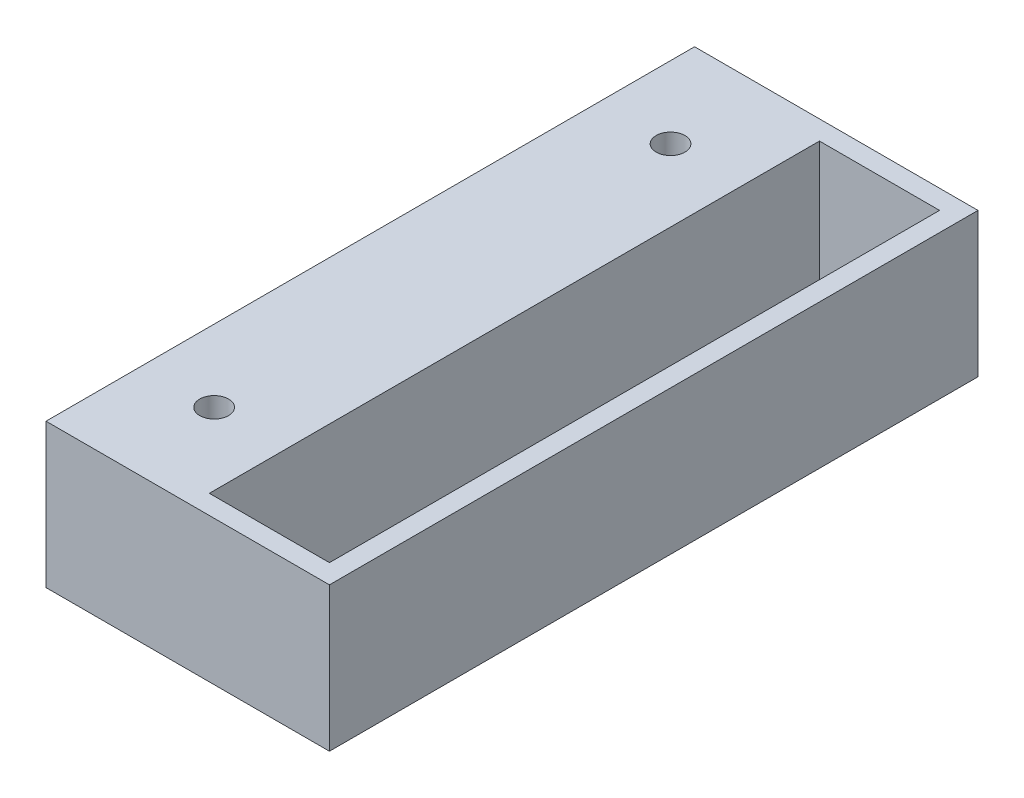
ISO-10303-21;
HEADER;
FILE_DESCRIPTION(('STEP AP214'),'2;1');
FILE_NAME('part.step','',(''),(''),'','','');
FILE_SCHEMA(('AUTOMOTIVE_DESIGN { 1 0 10303 214 1 1 1 1 }'));
ENDSEC;
DATA;
#1=APPLICATION_CONTEXT('core data for automotive mechanical design processes');
#2=APPLICATION_PROTOCOL_DEFINITION('international standard','automotive_design',2000,#1);
#3=PRODUCT_CONTEXT('',#1,'mechanical');
#4=PRODUCT('Part','Part','',(#3));
#5=PRODUCT_RELATED_PRODUCT_CATEGORY('part','',(#4));
#6=PRODUCT_DEFINITION_FORMATION('','',#4);
#7=PRODUCT_DEFINITION_CONTEXT('part definition',#1,'design');
#8=PRODUCT_DEFINITION('design','',#6,#7);
#9=PRODUCT_DEFINITION_SHAPE('','',#8);
#10=(LENGTH_UNIT() NAMED_UNIT(*) SI_UNIT(.MILLI.,.METRE.));
#11=(NAMED_UNIT(*) PLANE_ANGLE_UNIT() SI_UNIT($,.RADIAN.));
#12=(NAMED_UNIT(*) SI_UNIT($,.STERADIAN.) SOLID_ANGLE_UNIT());
#13=UNCERTAINTY_MEASURE_WITH_UNIT(LENGTH_MEASURE(1.E-05),#10,'distance_accuracy_value','');
#14=(GEOMETRIC_REPRESENTATION_CONTEXT(3) GLOBAL_UNCERTAINTY_ASSIGNED_CONTEXT((#13)) GLOBAL_UNIT_ASSIGNED_CONTEXT((#10,
#11,#12)) REPRESENTATION_CONTEXT('',''));
#15=CARTESIAN_POINT('',(0.,0.,0.));
#16=DIRECTION('',(0.,0.,1.));
#17=DIRECTION('',(1.,0.,0.));
#18=AXIS2_PLACEMENT_3D('',#15,#16,#17);
#19=CARTESIAN_POINT('',(0.,15.,0.));
#20=DIRECTION('',(0.,-1.,0.));
#21=DIRECTION('',(0.,0.,-1.));
#22=AXIS2_PLACEMENT_3D('',#19,#20,#21);
#23=PLANE('',#22);
#24=CARTESIAN_POINT('',(-13.75,15.,23.75));
#25=DIRECTION('',(0.,1.,0.));
#26=DIRECTION('',(0.,0.,1.));
#27=AXIS2_PLACEMENT_3D('',#24,#25,#26);
#28=CIRCLE('',#27,1.5);
#29=CARTESIAN_POINT('',(-13.75,15.,25.25));
#30=VERTEX_POINT('',#29);
#31=EDGE_CURVE('E127',#30,#30,#28,.T.);
#32=ORIENTED_EDGE('',*,*,#31,.F.);
#33=EDGE_LOOP('',(#32));
#34=FACE_BOUND('',#33,.T.);
#35=DIRECTION('',(-1.,0.,0.));
#36=VECTOR('',#35,1.);
#37=CARTESIAN_POINT('',(-8.24999999999999,15.,-33.75));
#38=LINE('',#37,#36);
#39=CARTESIAN_POINT('',(8.25,15.,-33.75));
#40=VERTEX_POINT('',#39);
#41=CARTESIAN_POINT('',(-21.25,15.,-33.75));
#42=VERTEX_POINT('',#41);
#43=EDGE_CURVE('E137',#40,#42,#38,.T.);
#44=ORIENTED_EDGE('',*,*,#43,.T.);
#45=DIRECTION('',(0.,0.,1.));
#46=VECTOR('',#45,1.);
#47=CARTESIAN_POINT('',(-21.25,15.,33.75));
#48=LINE('',#47,#46);
#49=CARTESIAN_POINT('',(-21.25,15.,33.75));
#50=VERTEX_POINT('',#49);
#51=EDGE_CURVE('E140',#42,#50,#48,.T.);
#52=ORIENTED_EDGE('',*,*,#51,.T.);
#53=DIRECTION('',(1.,0.,0.));
#54=VECTOR('',#53,1.);
#55=CARTESIAN_POINT('',(-8.24999999999999,15.,33.75));
#56=LINE('',#55,#54);
#57=CARTESIAN_POINT('',(8.25000000000001,15.,33.75));
#58=VERTEX_POINT('',#57);
#59=EDGE_CURVE('E143',#50,#58,#56,.T.);
#60=ORIENTED_EDGE('',*,*,#59,.T.);
#61=DIRECTION('',(0.,0.,-1.));
#62=VECTOR('',#61,1.);
#63=CARTESIAN_POINT('',(8.25000000000001,15.,33.75));
#64=LINE('',#63,#62);
#65=EDGE_CURVE('E145',#58,#40,#64,.T.);
#66=ORIENTED_EDGE('',*,*,#65,.T.);
#67=EDGE_LOOP('',(#44,#52,#60,#66));
#68=FACE_BOUND('',#67,.T.);
#69=DIRECTION('',(0.,0.,-1.));
#70=VECTOR('',#69,1.);
#71=CARTESIAN_POINT('',(6.25,15.,31.75));
#72=LINE('',#71,#70);
#73=CARTESIAN_POINT('',(6.25,15.,31.75));
#74=VERTEX_POINT('',#73);
#75=CARTESIAN_POINT('',(6.25,15.,-31.75));
#76=VERTEX_POINT('',#75);
#77=EDGE_CURVE('E98',#74,#76,#72,.T.);
#78=ORIENTED_EDGE('',*,*,#77,.F.);
#79=DIRECTION('',(1.,0.,0.));
#80=VECTOR('',#79,1.);
#81=CARTESIAN_POINT('',(-6.25,15.,31.75));
#82=LINE('',#81,#80);
#83=CARTESIAN_POINT('',(-6.25,15.,31.75));
#84=VERTEX_POINT('',#83);
#85=EDGE_CURVE('E121',#84,#74,#82,.T.);
#86=ORIENTED_EDGE('',*,*,#85,.F.);
#87=DIRECTION('',(0.,0.,1.));
#88=VECTOR('',#87,1.);
#89=CARTESIAN_POINT('',(-6.25,15.,31.75));
#90=LINE('',#89,#88);
#91=CARTESIAN_POINT('',(-6.25,15.,-31.75));
#92=VERTEX_POINT('',#91);
#93=EDGE_CURVE('E119',#92,#84,#90,.T.);
#94=ORIENTED_EDGE('',*,*,#93,.F.);
#95=DIRECTION('',(-1.,0.,0.));
#96=VECTOR('',#95,1.);
#97=CARTESIAN_POINT('',(-6.25,15.,-31.75));
#98=LINE('',#97,#96);
#99=EDGE_CURVE('E106',#76,#92,#98,.T.);
#100=ORIENTED_EDGE('',*,*,#99,.F.);
#101=EDGE_LOOP('',(#78,#86,#94,#100));
#102=FACE_BOUND('',#101,.T.);
#103=CARTESIAN_POINT('',(-13.75,15.,-23.75));
#104=DIRECTION('',(0.,1.,0.));
#105=DIRECTION('',(0.,0.,1.));
#106=AXIS2_PLACEMENT_3D('',#103,#104,#105);
#107=CIRCLE('',#106,1.5);
#108=CARTESIAN_POINT('',(-13.75,15.,-22.25));
#109=VERTEX_POINT('',#108);
#110=EDGE_CURVE('E294',#109,#109,#107,.T.);
#111=ORIENTED_EDGE('',*,*,#110,.F.);
#112=EDGE_LOOP('',(#111));
#113=FACE_BOUND('',#112,.T.);
#114=ADVANCED_FACE('F33',(#34,#68,#102,#113),#23,.F.);
#115=CARTESIAN_POINT('',(0.,0.,0.));
#116=DIRECTION('',(0.,-1.,0.));
#117=DIRECTION('',(0.,0.,-1.));
#118=AXIS2_PLACEMENT_3D('',#115,#116,#117);
#119=PLANE('',#118);
#120=CARTESIAN_POINT('',(-13.75,0.,23.75));
#121=DIRECTION('',(0.,1.,0.));
#122=DIRECTION('',(0.,0.,1.));
#123=AXIS2_PLACEMENT_3D('',#120,#121,#122);
#124=CIRCLE('',#123,1.5);
#125=CARTESIAN_POINT('',(-13.75,0.,25.25));
#126=VERTEX_POINT('',#125);
#127=EDGE_CURVE('E300',#126,#126,#124,.T.);
#128=ORIENTED_EDGE('',*,*,#127,.T.);
#129=EDGE_LOOP('',(#128));
#130=FACE_BOUND('',#129,.T.);
#131=DIRECTION('',(0.,0.,1.));
#132=VECTOR('',#131,1.);
#133=CARTESIAN_POINT('',(-21.25,0.,33.75));
#134=LINE('',#133,#132);
#135=CARTESIAN_POINT('',(-21.25,0.,-33.75));
#136=VERTEX_POINT('',#135);
#137=CARTESIAN_POINT('',(-21.25,0.,33.75));
#138=VERTEX_POINT('',#137);
#139=EDGE_CURVE('E114',#136,#138,#134,.T.);
#140=ORIENTED_EDGE('',*,*,#139,.F.);
#141=DIRECTION('',(-1.,0.,0.));
#142=VECTOR('',#141,1.);
#143=CARTESIAN_POINT('',(-8.24999999999999,0.,-33.75));
#144=LINE('',#143,#142);
#145=CARTESIAN_POINT('',(8.25,0.,-33.75));
#146=VERTEX_POINT('',#145);
#147=EDGE_CURVE('E141',#146,#136,#144,.T.);
#148=ORIENTED_EDGE('',*,*,#147,.F.);
#149=DIRECTION('',(0.,0.,-1.));
#150=VECTOR('',#149,1.);
#151=CARTESIAN_POINT('',(8.25000000000001,0.,33.75));
#152=LINE('',#151,#150);
#153=CARTESIAN_POINT('',(8.25000000000001,0.,33.75));
#154=VERTEX_POINT('',#153);
#155=EDGE_CURVE('E153',#154,#146,#152,.T.);
#156=ORIENTED_EDGE('',*,*,#155,.F.);
#157=DIRECTION('',(1.,0.,0.));
#158=VECTOR('',#157,1.);
#159=CARTESIAN_POINT('',(-8.24999999999999,0.,33.75));
#160=LINE('',#159,#158);
#161=EDGE_CURVE('E151',#138,#154,#160,.T.);
#162=ORIENTED_EDGE('',*,*,#161,.F.);
#163=EDGE_LOOP('',(#140,#148,#156,#162));
#164=FACE_BOUND('',#163,.T.);
#165=DIRECTION('',(1.,0.,0.));
#166=VECTOR('',#165,1.);
#167=CARTESIAN_POINT('',(-6.25,0.,31.75));
#168=LINE('',#167,#166);
#169=CARTESIAN_POINT('',(-6.25,0.,31.75));
#170=VERTEX_POINT('',#169);
#171=CARTESIAN_POINT('',(6.25,0.,31.75));
#172=VERTEX_POINT('',#171);
#173=EDGE_CURVE('E107',#170,#172,#168,.T.);
#174=ORIENTED_EDGE('',*,*,#173,.T.);
#175=DIRECTION('',(0.,0.,-1.));
#176=VECTOR('',#175,1.);
#177=CARTESIAN_POINT('',(6.25,0.,31.75));
#178=LINE('',#177,#176);
#179=CARTESIAN_POINT('',(6.25,0.,-31.75));
#180=VERTEX_POINT('',#179);
#181=EDGE_CURVE('E56',#172,#180,#178,.T.);
#182=ORIENTED_EDGE('',*,*,#181,.T.);
#183=DIRECTION('',(-1.,0.,0.));
#184=VECTOR('',#183,1.);
#185=CARTESIAN_POINT('',(-6.25,0.,-31.75));
#186=LINE('',#185,#184);
#187=CARTESIAN_POINT('',(-6.25,0.,-31.75));
#188=VERTEX_POINT('',#187);
#189=EDGE_CURVE('E113',#180,#188,#186,.T.);
#190=ORIENTED_EDGE('',*,*,#189,.T.);
#191=DIRECTION('',(0.,0.,1.));
#192=VECTOR('',#191,1.);
#193=CARTESIAN_POINT('',(-6.25,0.,31.75));
#194=LINE('',#193,#192);
#195=EDGE_CURVE('E129',#188,#170,#194,.T.);
#196=ORIENTED_EDGE('',*,*,#195,.T.);
#197=EDGE_LOOP('',(#174,#182,#190,#196));
#198=FACE_BOUND('',#197,.T.);
#199=CARTESIAN_POINT('',(-13.75,0.,-23.75));
#200=DIRECTION('',(0.,1.,0.));
#201=DIRECTION('',(0.,0.,1.));
#202=AXIS2_PLACEMENT_3D('',#199,#200,#201);
#203=CIRCLE('',#202,1.5);
#204=CARTESIAN_POINT('',(-13.75,0.,-22.25));
#205=VERTEX_POINT('',#204);
#206=EDGE_CURVE('E297',#205,#205,#203,.T.);
#207=ORIENTED_EDGE('',*,*,#206,.T.);
#208=EDGE_LOOP('',(#207));
#209=FACE_BOUND('',#208,.T.);
#210=ADVANCED_FACE('F171',(#130,#164,#198,#209),#119,.T.);
#211=CARTESIAN_POINT('',(-21.25,15.,33.75));
#212=DIRECTION('',(1.,0.,0.));
#213=DIRECTION('',(0.,0.,-1.));
#214=AXIS2_PLACEMENT_3D('',#211,#212,#213);
#215=PLANE('',#214);
#216=ORIENTED_EDGE('',*,*,#139,.T.);
#217=DIRECTION('',(0.,-1.,0.));
#218=VECTOR('',#217,1.);
#219=CARTESIAN_POINT('',(-21.25,15.,33.75));
#220=LINE('',#219,#218);
#221=EDGE_CURVE('E41',#50,#138,#220,.T.);
#222=ORIENTED_EDGE('',*,*,#221,.F.);
#223=ORIENTED_EDGE('',*,*,#51,.F.);
#224=DIRECTION('',(0.,-1.,0.));
#225=VECTOR('',#224,1.);
#226=CARTESIAN_POINT('',(-21.25,15.,-33.75));
#227=LINE('',#226,#225);
#228=EDGE_CURVE('E11',#42,#136,#227,.T.);
#229=ORIENTED_EDGE('',*,*,#228,.T.);
#230=EDGE_LOOP('',(#216,#222,#223,#229));
#231=FACE_BOUND('',#230,.T.);
#232=ADVANCED_FACE('F35',(#231),#215,.F.);
#233=CARTESIAN_POINT('',(-8.24999999999999,15.,33.75));
#234=DIRECTION('',(0.,0.,-1.));
#235=DIRECTION('',(-1.,0.,0.));
#236=AXIS2_PLACEMENT_3D('',#233,#234,#235);
#237=PLANE('',#236);
#238=ORIENTED_EDGE('',*,*,#161,.T.);
#239=DIRECTION('',(0.,-1.,0.));
#240=VECTOR('',#239,1.);
#241=CARTESIAN_POINT('',(8.25000000000001,15.,33.75));
#242=LINE('',#241,#240);
#243=EDGE_CURVE('E158',#58,#154,#242,.T.);
#244=ORIENTED_EDGE('',*,*,#243,.F.);
#245=ORIENTED_EDGE('',*,*,#59,.F.);
#246=ORIENTED_EDGE('',*,*,#221,.T.);
#247=EDGE_LOOP('',(#238,#244,#245,#246));
#248=FACE_BOUND('',#247,.T.);
#249=ADVANCED_FACE('F164',(#248),#237,.F.);
#250=CARTESIAN_POINT('',(8.25000000000001,15.,33.75));
#251=DIRECTION('',(-1.,0.,0.));
#252=DIRECTION('',(0.,0.,1.));
#253=AXIS2_PLACEMENT_3D('',#250,#251,#252);
#254=PLANE('',#253);
#255=ORIENTED_EDGE('',*,*,#155,.T.);
#256=DIRECTION('',(0.,-1.,0.));
#257=VECTOR('',#256,1.);
#258=CARTESIAN_POINT('',(8.25,15.,-33.75));
#259=LINE('',#258,#257);
#260=EDGE_CURVE('E148',#40,#146,#259,.T.);
#261=ORIENTED_EDGE('',*,*,#260,.F.);
#262=ORIENTED_EDGE('',*,*,#65,.F.);
#263=ORIENTED_EDGE('',*,*,#243,.T.);
#264=EDGE_LOOP('',(#255,#261,#262,#263));
#265=FACE_BOUND('',#264,.T.);
#266=ADVANCED_FACE('F176',(#265),#254,.F.);
#267=CARTESIAN_POINT('',(-8.24999999999999,15.,-33.75));
#268=DIRECTION('',(0.,0.,1.));
#269=DIRECTION('',(1.,0.,0.));
#270=AXIS2_PLACEMENT_3D('',#267,#268,#269);
#271=PLANE('',#270);
#272=ORIENTED_EDGE('',*,*,#147,.T.);
#273=ORIENTED_EDGE('',*,*,#228,.F.);
#274=ORIENTED_EDGE('',*,*,#43,.F.);
#275=ORIENTED_EDGE('',*,*,#260,.T.);
#276=EDGE_LOOP('',(#272,#273,#274,#275));
#277=FACE_BOUND('',#276,.T.);
#278=ADVANCED_FACE('F179',(#277),#271,.F.);
#279=CARTESIAN_POINT('',(6.25,15.,31.75));
#280=DIRECTION('',(-1.,0.,0.));
#281=DIRECTION('',(0.,0.,1.));
#282=AXIS2_PLACEMENT_3D('',#279,#280,#281);
#283=PLANE('',#282);
#284=ORIENTED_EDGE('',*,*,#181,.F.);
#285=DIRECTION('',(0.,-1.,0.));
#286=VECTOR('',#285,1.);
#287=CARTESIAN_POINT('',(6.25,15.,31.75));
#288=LINE('',#287,#286);
#289=EDGE_CURVE('E102',#74,#172,#288,.T.);
#290=ORIENTED_EDGE('',*,*,#289,.F.);
#291=ORIENTED_EDGE('',*,*,#77,.T.);
#292=DIRECTION('',(0.,-1.,0.));
#293=VECTOR('',#292,1.);
#294=CARTESIAN_POINT('',(6.25,15.,-31.75));
#295=LINE('',#294,#293);
#296=EDGE_CURVE('E101',#76,#180,#295,.T.);
#297=ORIENTED_EDGE('',*,*,#296,.T.);
#298=EDGE_LOOP('',(#284,#290,#291,#297));
#299=FACE_BOUND('',#298,.T.);
#300=ADVANCED_FACE('F100',(#299),#283,.T.);
#301=CARTESIAN_POINT('',(-6.25,15.,-31.75));
#302=DIRECTION('',(0.,0.,1.));
#303=DIRECTION('',(1.,0.,0.));
#304=AXIS2_PLACEMENT_3D('',#301,#302,#303);
#305=PLANE('',#304);
#306=ORIENTED_EDGE('',*,*,#189,.F.);
#307=ORIENTED_EDGE('',*,*,#296,.F.);
#308=ORIENTED_EDGE('',*,*,#99,.T.);
#309=DIRECTION('',(0.,-1.,0.));
#310=VECTOR('',#309,1.);
#311=CARTESIAN_POINT('',(-6.25,15.,-31.75));
#312=LINE('',#311,#310);
#313=EDGE_CURVE('E115',#92,#188,#312,.T.);
#314=ORIENTED_EDGE('',*,*,#313,.T.);
#315=EDGE_LOOP('',(#306,#307,#308,#314));
#316=FACE_BOUND('',#315,.T.);
#317=ADVANCED_FACE('F110',(#316),#305,.T.);
#318=CARTESIAN_POINT('',(-6.25,15.,31.75));
#319=DIRECTION('',(1.,0.,0.));
#320=DIRECTION('',(0.,0.,-1.));
#321=AXIS2_PLACEMENT_3D('',#318,#319,#320);
#322=PLANE('',#321);
#323=ORIENTED_EDGE('',*,*,#195,.F.);
#324=ORIENTED_EDGE('',*,*,#313,.F.);
#325=ORIENTED_EDGE('',*,*,#93,.T.);
#326=DIRECTION('',(0.,-1.,0.));
#327=VECTOR('',#326,1.);
#328=CARTESIAN_POINT('',(-6.25,15.,31.75));
#329=LINE('',#328,#327);
#330=EDGE_CURVE('E48',#84,#170,#329,.T.);
#331=ORIENTED_EDGE('',*,*,#330,.T.);
#332=EDGE_LOOP('',(#323,#324,#325,#331));
#333=FACE_BOUND('',#332,.T.);
#334=ADVANCED_FACE('F248',(#333),#322,.T.);
#335=CARTESIAN_POINT('',(-6.25,15.,31.75));
#336=DIRECTION('',(0.,0.,-1.));
#337=DIRECTION('',(-1.,0.,0.));
#338=AXIS2_PLACEMENT_3D('',#335,#336,#337);
#339=PLANE('',#338);
#340=ORIENTED_EDGE('',*,*,#173,.F.);
#341=ORIENTED_EDGE('',*,*,#330,.F.);
#342=ORIENTED_EDGE('',*,*,#85,.T.);
#343=ORIENTED_EDGE('',*,*,#289,.T.);
#344=EDGE_LOOP('',(#340,#341,#342,#343));
#345=FACE_BOUND('',#344,.T.);
#346=ADVANCED_FACE('F255',(#345),#339,.T.);
#347=CARTESIAN_POINT('',(-13.75,15.,23.75));
#348=DIRECTION('',(0.,-1.,0.));
#349=DIRECTION('',(0.,0.,-1.));
#350=AXIS2_PLACEMENT_3D('',#347,#348,#349);
#351=CYLINDRICAL_SURFACE('',#350,1.5);
#352=ORIENTED_EDGE('',*,*,#31,.T.);
#353=EDGE_LOOP('',(#352));
#354=FACE_BOUND('',#353,.T.);
#355=ORIENTED_EDGE('',*,*,#127,.F.);
#356=EDGE_LOOP('',(#355));
#357=FACE_BOUND('',#356,.T.);
#358=ADVANCED_FACE('F264',(#354,#357),#351,.F.);
#359=CARTESIAN_POINT('',(-13.75,15.,-23.75));
#360=DIRECTION('',(0.,-1.,0.));
#361=DIRECTION('',(0.,0.,-1.));
#362=AXIS2_PLACEMENT_3D('',#359,#360,#361);
#363=CYLINDRICAL_SURFACE('',#362,1.5);
#364=ORIENTED_EDGE('',*,*,#110,.T.);
#365=EDGE_LOOP('',(#364));
#366=FACE_BOUND('',#365,.T.);
#367=ORIENTED_EDGE('',*,*,#206,.F.);
#368=EDGE_LOOP('',(#367));
#369=FACE_BOUND('',#368,.T.);
#370=ADVANCED_FACE('F272',(#366,#369),#363,.F.);
#371=CLOSED_SHELL('',(#114,#210,#232,#249,#266,#278,#300,#317,#334,#346,#358,#370));
#372=MANIFOLD_SOLID_BREP('B2',#371);
#373=ADVANCED_BREP_SHAPE_REPRESENTATION('',(#18,#372),#14);
#374=SHAPE_DEFINITION_REPRESENTATION(#9,#373);
ENDSEC;
END-ISO-10303-21;
